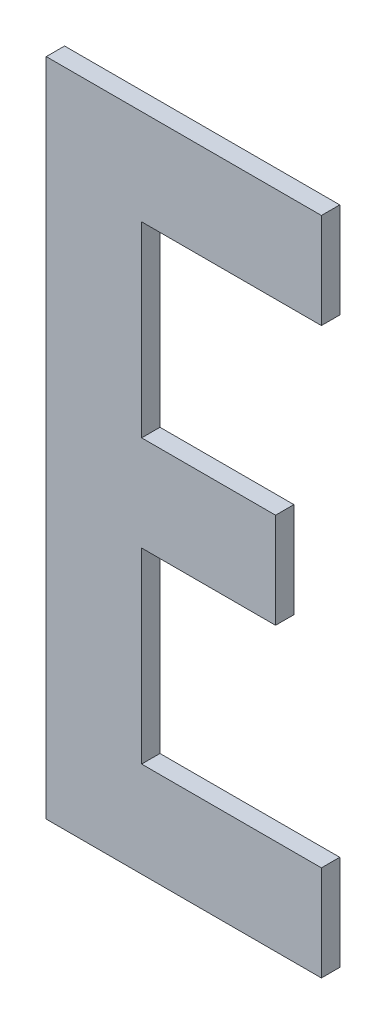
ISO-10303-21;
HEADER;
FILE_DESCRIPTION(('STEP AP214'),'2;1');
FILE_NAME('part.step','',(''),(''),'','','');
FILE_SCHEMA(('AUTOMOTIVE_DESIGN { 1 0 10303 214 1 1 1 1 }'));
ENDSEC;
DATA;
#1=APPLICATION_CONTEXT('core data for automotive mechanical design processes');
#2=APPLICATION_PROTOCOL_DEFINITION('international standard','automotive_design',2000,#1);
#3=PRODUCT_CONTEXT('',#1,'mechanical');
#4=PRODUCT('Part','Part','',(#3));
#5=PRODUCT_RELATED_PRODUCT_CATEGORY('part','',(#4));
#6=PRODUCT_DEFINITION_FORMATION('','',#4);
#7=PRODUCT_DEFINITION_CONTEXT('part definition',#1,'design');
#8=PRODUCT_DEFINITION('design','',#6,#7);
#9=PRODUCT_DEFINITION_SHAPE('','',#8);
#10=(LENGTH_UNIT() NAMED_UNIT(*) SI_UNIT(.MILLI.,.METRE.));
#11=(NAMED_UNIT(*) PLANE_ANGLE_UNIT() SI_UNIT($,.RADIAN.));
#12=(NAMED_UNIT(*) SI_UNIT($,.STERADIAN.) SOLID_ANGLE_UNIT());
#13=UNCERTAINTY_MEASURE_WITH_UNIT(LENGTH_MEASURE(1.E-05),#10,'distance_accuracy_value','');
#14=(GEOMETRIC_REPRESENTATION_CONTEXT(3) GLOBAL_UNCERTAINTY_ASSIGNED_CONTEXT((#13)) GLOBAL_UNIT_ASSIGNED_CONTEXT((#10,
#11,#12)) REPRESENTATION_CONTEXT('',''));
#15=CARTESIAN_POINT('',(0.,0.,0.));
#16=DIRECTION('',(0.,0.,1.));
#17=DIRECTION('',(1.,0.,0.));
#18=AXIS2_PLACEMENT_3D('',#15,#16,#17);
#19=CARTESIAN_POINT('',(0.,374.566226912929,25.4));
#20=DIRECTION('',(0.,-1.,0.));
#21=DIRECTION('',(0.,0.,-1.));
#22=AXIS2_PLACEMENT_3D('',#19,#20,#21);
#23=PLANE('',#22);
#24=DIRECTION('',(-1.,0.,0.));
#25=VECTOR('',#24,1.);
#26=CARTESIAN_POINT('',(0.,374.566226912929,0.));
#27=LINE('',#26,#25);
#28=CARTESIAN_POINT('',(381.,374.566226912929,0.));
#29=VERTEX_POINT('',#28);
#30=CARTESIAN_POINT('',(0.,374.566226912929,0.));
#31=VERTEX_POINT('',#30);
#32=EDGE_CURVE('E153',#29,#31,#27,.T.);
#33=ORIENTED_EDGE('',*,*,#32,.T.);
#34=DIRECTION('',(0.,0.,-1.));
#35=VECTOR('',#34,1.);
#36=CARTESIAN_POINT('',(0.,374.566226912929,25.4));
#37=LINE('',#36,#35);
#38=CARTESIAN_POINT('',(0.,374.566226912929,25.4));
#39=VERTEX_POINT('',#38);
#40=EDGE_CURVE('E11',#39,#31,#37,.T.);
#41=ORIENTED_EDGE('',*,*,#40,.F.);
#42=DIRECTION('',(-1.,0.,0.));
#43=VECTOR('',#42,1.);
#44=CARTESIAN_POINT('',(0.,374.566226912929,25.4));
#45=LINE('',#44,#43);
#46=CARTESIAN_POINT('',(381.,374.566226912929,25.4));
#47=VERTEX_POINT('',#46);
#48=EDGE_CURVE('E175',#47,#39,#45,.T.);
#49=ORIENTED_EDGE('',*,*,#48,.F.);
#50=DIRECTION('',(0.,0.,-1.));
#51=VECTOR('',#50,1.);
#52=CARTESIAN_POINT('',(381.,374.566226912929,25.4));
#53=LINE('',#52,#51);
#54=EDGE_CURVE('E149',#47,#29,#53,.T.);
#55=ORIENTED_EDGE('',*,*,#54,.T.);
#56=EDGE_LOOP('',(#33,#41,#49,#55));
#57=FACE_BOUND('',#56,.T.);
#58=ADVANCED_FACE('F33',(#57),#23,.F.);
#59=CARTESIAN_POINT('',(0.,374.566226912929,25.4));
#60=DIRECTION('',(1.,0.,0.));
#61=DIRECTION('',(0.,0.,-1.));
#62=AXIS2_PLACEMENT_3D('',#59,#60,#61);
#63=PLANE('',#62);
#64=DIRECTION('',(0.,-1.,0.));
#65=VECTOR('',#64,1.);
#66=CARTESIAN_POINT('',(0.,374.566226912929,0.));
#67=LINE('',#66,#65);
#68=CARTESIAN_POINT('',(0.,-539.833773087071,0.));
#69=VERTEX_POINT('',#68);
#70=EDGE_CURVE('E156',#31,#69,#67,.T.);
#71=ORIENTED_EDGE('',*,*,#70,.T.);
#72=DIRECTION('',(0.,0.,-1.));
#73=VECTOR('',#72,1.);
#74=CARTESIAN_POINT('',(0.,-539.833773087071,25.4));
#75=LINE('',#74,#73);
#76=CARTESIAN_POINT('',(0.,-539.833773087071,25.4));
#77=VERTEX_POINT('',#76);
#78=EDGE_CURVE('E41',#77,#69,#75,.T.);
#79=ORIENTED_EDGE('',*,*,#78,.F.);
#80=DIRECTION('',(0.,-1.,0.));
#81=VECTOR('',#80,1.);
#82=CARTESIAN_POINT('',(0.,374.566226912929,25.4));
#83=LINE('',#82,#81);
#84=EDGE_CURVE('E104',#39,#77,#83,.T.);
#85=ORIENTED_EDGE('',*,*,#84,.F.);
#86=ORIENTED_EDGE('',*,*,#40,.T.);
#87=EDGE_LOOP('',(#71,#79,#85,#86));
#88=FACE_BOUND('',#87,.T.);
#89=ADVANCED_FACE('F253',(#88),#63,.F.);
#90=CARTESIAN_POINT('',(381.,-539.833773087071,25.4));
#91=DIRECTION('',(0.,1.,0.));
#92=DIRECTION('',(0.,0.,1.));
#93=AXIS2_PLACEMENT_3D('',#90,#91,#92);
#94=PLANE('',#93);
#95=DIRECTION('',(1.,0.,0.));
#96=VECTOR('',#95,1.);
#97=CARTESIAN_POINT('',(381.,-539.833773087071,0.));
#98=LINE('',#97,#96);
#99=CARTESIAN_POINT('',(381.,-539.833773087071,0.));
#100=VERTEX_POINT('',#99);
#101=EDGE_CURVE('E158',#69,#100,#98,.T.);
#102=ORIENTED_EDGE('',*,*,#101,.T.);
#103=DIRECTION('',(0.,0.,-1.));
#104=VECTOR('',#103,1.);
#105=CARTESIAN_POINT('',(381.,-539.833773087071,25.4));
#106=LINE('',#105,#104);
#107=CARTESIAN_POINT('',(381.,-539.833773087071,25.4));
#108=VERTEX_POINT('',#107);
#109=EDGE_CURVE('E194',#108,#100,#106,.T.);
#110=ORIENTED_EDGE('',*,*,#109,.F.);
#111=DIRECTION('',(1.,0.,0.));
#112=VECTOR('',#111,1.);
#113=CARTESIAN_POINT('',(381.,-539.833773087071,25.4));
#114=LINE('',#113,#112);
#115=EDGE_CURVE('E202',#77,#108,#114,.T.);
#116=ORIENTED_EDGE('',*,*,#115,.F.);
#117=ORIENTED_EDGE('',*,*,#78,.T.);
#118=EDGE_LOOP('',(#102,#110,#116,#117));
#119=FACE_BOUND('',#118,.T.);
#120=ADVANCED_FACE('F200',(#119),#94,.F.);
#121=CARTESIAN_POINT('',(381.,-407.753773087071,25.4));
#122=DIRECTION('',(-1.,0.,0.));
#123=DIRECTION('',(0.,0.,1.));
#124=AXIS2_PLACEMENT_3D('',#121,#122,#123);
#125=PLANE('',#124);
#126=DIRECTION('',(0.,1.,0.));
#127=VECTOR('',#126,1.);
#128=CARTESIAN_POINT('',(381.,-407.753773087071,0.));
#129=LINE('',#128,#127);
#130=CARTESIAN_POINT('',(381.,-407.753773087071,0.));
#131=VERTEX_POINT('',#130);
#132=EDGE_CURVE('E160',#100,#131,#129,.T.);
#133=ORIENTED_EDGE('',*,*,#132,.T.);
#134=DIRECTION('',(0.,0.,-1.));
#135=VECTOR('',#134,1.);
#136=CARTESIAN_POINT('',(381.,-407.753773087071,25.4));
#137=LINE('',#136,#135);
#138=CARTESIAN_POINT('',(381.,-407.753773087071,25.4));
#139=VERTEX_POINT('',#138);
#140=EDGE_CURVE('E191',#139,#131,#137,.T.);
#141=ORIENTED_EDGE('',*,*,#140,.F.);
#142=DIRECTION('',(0.,1.,0.));
#143=VECTOR('',#142,1.);
#144=CARTESIAN_POINT('',(381.,-407.753773087071,25.4));
#145=LINE('',#144,#143);
#146=EDGE_CURVE('E220',#108,#139,#145,.T.);
#147=ORIENTED_EDGE('',*,*,#146,.F.);
#148=ORIENTED_EDGE('',*,*,#109,.T.);
#149=EDGE_LOOP('',(#133,#141,#147,#148));
#150=FACE_BOUND('',#149,.T.);
#151=ADVANCED_FACE('F211',(#150),#125,.F.);
#152=CARTESIAN_POINT('',(132.08,-407.753773087071,25.4));
#153=DIRECTION('',(0.,-1.,0.));
#154=DIRECTION('',(0.,0.,-1.));
#155=AXIS2_PLACEMENT_3D('',#152,#153,#154);
#156=PLANE('',#155);
#157=DIRECTION('',(-1.,0.,0.));
#158=VECTOR('',#157,1.);
#159=CARTESIAN_POINT('',(132.08,-407.753773087071,0.));
#160=LINE('',#159,#158);
#161=CARTESIAN_POINT('',(132.08,-407.753773087071,0.));
#162=VERTEX_POINT('',#161);
#163=EDGE_CURVE('E162',#131,#162,#160,.T.);
#164=ORIENTED_EDGE('',*,*,#163,.T.);
#165=DIRECTION('',(0.,0.,-1.));
#166=VECTOR('',#165,1.);
#167=CARTESIAN_POINT('',(132.08,-407.753773087071,25.4));
#168=LINE('',#167,#166);
#169=CARTESIAN_POINT('',(132.08,-407.753773087071,25.4));
#170=VERTEX_POINT('',#169);
#171=EDGE_CURVE('E188',#170,#162,#168,.T.);
#172=ORIENTED_EDGE('',*,*,#171,.F.);
#173=DIRECTION('',(-1.,0.,0.));
#174=VECTOR('',#173,1.);
#175=CARTESIAN_POINT('',(132.08,-407.753773087071,25.4));
#176=LINE('',#175,#174);
#177=EDGE_CURVE('E217',#139,#170,#176,.T.);
#178=ORIENTED_EDGE('',*,*,#177,.F.);
#179=ORIENTED_EDGE('',*,*,#140,.T.);
#180=EDGE_LOOP('',(#164,#172,#178,#179));
#181=FACE_BOUND('',#180,.T.);
#182=ADVANCED_FACE('F215',(#181),#156,.F.);
#183=CARTESIAN_POINT('',(132.08,-148.673773087071,25.4));
#184=DIRECTION('',(-1.,0.,0.));
#185=DIRECTION('',(0.,-1.,0.));
#186=AXIS2_PLACEMENT_3D('',#183,#184,#185);
#187=PLANE('',#186);
#188=DIRECTION('',(0.,1.,0.));
#189=VECTOR('',#188,1.);
#190=CARTESIAN_POINT('',(132.08,-148.673773087071,0.));
#191=LINE('',#190,#189);
#192=CARTESIAN_POINT('',(132.08,-148.673773087071,0.));
#193=VERTEX_POINT('',#192);
#194=EDGE_CURVE('E164',#162,#193,#191,.T.);
#195=ORIENTED_EDGE('',*,*,#194,.T.);
#196=DIRECTION('',(0.,0.,-1.));
#197=VECTOR('',#196,1.);
#198=CARTESIAN_POINT('',(132.08,-148.673773087071,25.4));
#199=LINE('',#198,#197);
#200=CARTESIAN_POINT('',(132.08,-148.673773087071,25.4));
#201=VERTEX_POINT('',#200);
#202=EDGE_CURVE('E185',#201,#193,#199,.T.);
#203=ORIENTED_EDGE('',*,*,#202,.F.);
#204=DIRECTION('',(0.,1.,0.));
#205=VECTOR('',#204,1.);
#206=CARTESIAN_POINT('',(132.08,-148.673773087071,25.4));
#207=LINE('',#206,#205);
#208=EDGE_CURVE('E219',#170,#201,#207,.T.);
#209=ORIENTED_EDGE('',*,*,#208,.F.);
#210=ORIENTED_EDGE('',*,*,#171,.T.);
#211=EDGE_LOOP('',(#195,#203,#209,#210));
#212=FACE_BOUND('',#211,.T.);
#213=ADVANCED_FACE('F266',(#212),#187,.F.);
#214=CARTESIAN_POINT('',(317.5,-148.673773087071,25.4));
#215=DIRECTION('',(0.,1.,0.));
#216=DIRECTION('',(-1.,0.,0.));
#217=AXIS2_PLACEMENT_3D('',#214,#215,#216);
#218=PLANE('',#217);
#219=DIRECTION('',(1.,0.,0.));
#220=VECTOR('',#219,1.);
#221=CARTESIAN_POINT('',(317.5,-148.673773087071,0.));
#222=LINE('',#221,#220);
#223=CARTESIAN_POINT('',(317.5,-148.673773087071,0.));
#224=VERTEX_POINT('',#223);
#225=EDGE_CURVE('E166',#193,#224,#222,.T.);
#226=ORIENTED_EDGE('',*,*,#225,.T.);
#227=DIRECTION('',(0.,0.,-1.));
#228=VECTOR('',#227,1.);
#229=CARTESIAN_POINT('',(317.5,-148.673773087071,25.4));
#230=LINE('',#229,#228);
#231=CARTESIAN_POINT('',(317.5,-148.673773087071,25.4));
#232=VERTEX_POINT('',#231);
#233=EDGE_CURVE('E182',#232,#224,#230,.T.);
#234=ORIENTED_EDGE('',*,*,#233,.F.);
#235=DIRECTION('',(1.,0.,0.));
#236=VECTOR('',#235,1.);
#237=CARTESIAN_POINT('',(317.5,-148.673773087071,25.4));
#238=LINE('',#237,#236);
#239=EDGE_CURVE('E222',#201,#232,#238,.T.);
#240=ORIENTED_EDGE('',*,*,#239,.F.);
#241=ORIENTED_EDGE('',*,*,#202,.T.);
#242=EDGE_LOOP('',(#226,#234,#240,#241));
#243=FACE_BOUND('',#242,.T.);
#244=ADVANCED_FACE('F269',(#243),#218,.F.);
#245=CARTESIAN_POINT('',(317.5,-16.5937730870713,25.4));
#246=DIRECTION('',(-1.,0.,0.));
#247=DIRECTION('',(0.,0.,1.));
#248=AXIS2_PLACEMENT_3D('',#245,#246,#247);
#249=PLANE('',#248);
#250=DIRECTION('',(0.,1.,0.));
#251=VECTOR('',#250,1.);
#252=CARTESIAN_POINT('',(317.5,-16.5937730870713,0.));
#253=LINE('',#252,#251);
#254=CARTESIAN_POINT('',(317.5,-16.5937730870713,0.));
#255=VERTEX_POINT('',#254);
#256=EDGE_CURVE('E168',#224,#255,#253,.T.);
#257=ORIENTED_EDGE('',*,*,#256,.T.);
#258=DIRECTION('',(0.,0.,-1.));
#259=VECTOR('',#258,1.);
#260=CARTESIAN_POINT('',(317.5,-16.5937730870713,25.4));
#261=LINE('',#260,#259);
#262=CARTESIAN_POINT('',(317.5,-16.5937730870713,25.4));
#263=VERTEX_POINT('',#262);
#264=EDGE_CURVE('E179',#263,#255,#261,.T.);
#265=ORIENTED_EDGE('',*,*,#264,.F.);
#266=DIRECTION('',(0.,1.,0.));
#267=VECTOR('',#266,1.);
#268=CARTESIAN_POINT('',(317.5,-16.5937730870713,25.4));
#269=LINE('',#268,#267);
#270=EDGE_CURVE('E228',#232,#263,#269,.T.);
#271=ORIENTED_EDGE('',*,*,#270,.F.);
#272=ORIENTED_EDGE('',*,*,#233,.T.);
#273=EDGE_LOOP('',(#257,#265,#271,#272));
#274=FACE_BOUND('',#273,.T.);
#275=ADVANCED_FACE('F234',(#274),#249,.F.);
#276=CARTESIAN_POINT('',(132.08,-16.5937730870713,25.4));
#277=DIRECTION('',(0.,-1.,0.));
#278=DIRECTION('',(0.,0.,-1.));
#279=AXIS2_PLACEMENT_3D('',#276,#277,#278);
#280=PLANE('',#279);
#281=DIRECTION('',(-1.,0.,0.));
#282=VECTOR('',#281,1.);
#283=CARTESIAN_POINT('',(132.08,-16.5937730870713,0.));
#284=LINE('',#283,#282);
#285=CARTESIAN_POINT('',(132.08,-16.5937730870713,0.));
#286=VERTEX_POINT('',#285);
#287=EDGE_CURVE('E170',#255,#286,#284,.T.);
#288=ORIENTED_EDGE('',*,*,#287,.T.);
#289=DIRECTION('',(0.,0.,-1.));
#290=VECTOR('',#289,1.);
#291=CARTESIAN_POINT('',(132.08,-16.5937730870713,25.4));
#292=LINE('',#291,#290);
#293=CARTESIAN_POINT('',(132.08,-16.5937730870713,25.4));
#294=VERTEX_POINT('',#293);
#295=EDGE_CURVE('E144',#294,#286,#292,.T.);
#296=ORIENTED_EDGE('',*,*,#295,.F.);
#297=DIRECTION('',(-1.,0.,0.));
#298=VECTOR('',#297,1.);
#299=CARTESIAN_POINT('',(132.08,-16.5937730870713,25.4));
#300=LINE('',#299,#298);
#301=EDGE_CURVE('E135',#263,#294,#300,.T.);
#302=ORIENTED_EDGE('',*,*,#301,.F.);
#303=ORIENTED_EDGE('',*,*,#264,.T.);
#304=EDGE_LOOP('',(#288,#296,#302,#303));
#305=FACE_BOUND('',#304,.T.);
#306=ADVANCED_FACE('F238',(#305),#280,.F.);
#307=CARTESIAN_POINT('',(132.08,242.486226912929,25.4));
#308=DIRECTION('',(-1.,0.,0.));
#309=DIRECTION('',(0.,-1.,0.));
#310=AXIS2_PLACEMENT_3D('',#307,#308,#309);
#311=PLANE('',#310);
#312=DIRECTION('',(0.,1.,0.));
#313=VECTOR('',#312,1.);
#314=CARTESIAN_POINT('',(132.08,242.486226912929,0.));
#315=LINE('',#314,#313);
#316=CARTESIAN_POINT('',(132.08,242.486226912929,0.));
#317=VERTEX_POINT('',#316);
#318=EDGE_CURVE('E143',#286,#317,#315,.T.);
#319=ORIENTED_EDGE('',*,*,#318,.T.);
#320=DIRECTION('',(0.,0.,-1.));
#321=VECTOR('',#320,1.);
#322=CARTESIAN_POINT('',(132.08,242.486226912929,25.4));
#323=LINE('',#322,#321);
#324=CARTESIAN_POINT('',(132.08,242.486226912929,25.4));
#325=VERTEX_POINT('',#324);
#326=EDGE_CURVE('E140',#325,#317,#323,.T.);
#327=ORIENTED_EDGE('',*,*,#326,.F.);
#328=DIRECTION('',(0.,1.,0.));
#329=VECTOR('',#328,1.);
#330=CARTESIAN_POINT('',(132.08,242.486226912929,25.4));
#331=LINE('',#330,#329);
#332=EDGE_CURVE('E129',#294,#325,#331,.T.);
#333=ORIENTED_EDGE('',*,*,#332,.F.);
#334=ORIENTED_EDGE('',*,*,#295,.T.);
#335=EDGE_LOOP('',(#319,#327,#333,#334));
#336=FACE_BOUND('',#335,.T.);
#337=ADVANCED_FACE('F141',(#336),#311,.F.);
#338=CARTESIAN_POINT('',(381.,242.486226912929,25.4));
#339=DIRECTION('',(0.,1.,0.));
#340=DIRECTION('',(-1.,0.,0.));
#341=AXIS2_PLACEMENT_3D('',#338,#339,#340);
#342=PLANE('',#341);
#343=DIRECTION('',(1.,0.,0.));
#344=VECTOR('',#343,1.);
#345=CARTESIAN_POINT('',(381.,242.486226912929,0.));
#346=LINE('',#345,#344);
#347=CARTESIAN_POINT('',(381.,242.486226912929,0.));
#348=VERTEX_POINT('',#347);
#349=EDGE_CURVE('E90',#317,#348,#346,.T.);
#350=ORIENTED_EDGE('',*,*,#349,.T.);
#351=DIRECTION('',(0.,0.,-1.));
#352=VECTOR('',#351,1.);
#353=CARTESIAN_POINT('',(381.,242.486226912929,25.4));
#354=LINE('',#353,#352);
#355=CARTESIAN_POINT('',(381.,242.486226912929,25.4));
#356=VERTEX_POINT('',#355);
#357=EDGE_CURVE('E145',#356,#348,#354,.T.);
#358=ORIENTED_EDGE('',*,*,#357,.F.);
#359=DIRECTION('',(1.,0.,0.));
#360=VECTOR('',#359,1.);
#361=CARTESIAN_POINT('',(381.,242.486226912929,25.4));
#362=LINE('',#361,#360);
#363=EDGE_CURVE('E133',#325,#356,#362,.T.);
#364=ORIENTED_EDGE('',*,*,#363,.F.);
#365=ORIENTED_EDGE('',*,*,#326,.T.);
#366=EDGE_LOOP('',(#350,#358,#364,#365));
#367=FACE_BOUND('',#366,.T.);
#368=ADVANCED_FACE('F147',(#367),#342,.F.);
#369=CARTESIAN_POINT('',(381.,374.566226912929,25.4));
#370=DIRECTION('',(-1.,0.,0.));
#371=DIRECTION('',(0.,0.,1.));
#372=AXIS2_PLACEMENT_3D('',#369,#370,#371);
#373=PLANE('',#372);
#374=DIRECTION('',(0.,1.,0.));
#375=VECTOR('',#374,1.);
#376=CARTESIAN_POINT('',(381.,374.566226912929,0.));
#377=LINE('',#376,#375);
#378=EDGE_CURVE('E96',#348,#29,#377,.T.);
#379=ORIENTED_EDGE('',*,*,#378,.T.);
#380=ORIENTED_EDGE('',*,*,#54,.F.);
#381=DIRECTION('',(0.,1.,0.));
#382=VECTOR('',#381,1.);
#383=CARTESIAN_POINT('',(381.,374.566226912929,25.4));
#384=LINE('',#383,#382);
#385=EDGE_CURVE('E49',#356,#47,#384,.T.);
#386=ORIENTED_EDGE('',*,*,#385,.F.);
#387=ORIENTED_EDGE('',*,*,#357,.T.);
#388=EDGE_LOOP('',(#379,#380,#386,#387));
#389=FACE_BOUND('',#388,.T.);
#390=ADVANCED_FACE('F242',(#389),#373,.F.);
#391=CARTESIAN_POINT('',(0.,0.,25.4));
#392=DIRECTION('',(0.,0.,-1.));
#393=DIRECTION('',(-1.,0.,0.));
#394=AXIS2_PLACEMENT_3D('',#391,#392,#393);
#395=PLANE('',#394);
#396=ORIENTED_EDGE('',*,*,#48,.T.);
#397=ORIENTED_EDGE('',*,*,#84,.T.);
#398=ORIENTED_EDGE('',*,*,#115,.T.);
#399=ORIENTED_EDGE('',*,*,#146,.T.);
#400=ORIENTED_EDGE('',*,*,#177,.T.);
#401=ORIENTED_EDGE('',*,*,#208,.T.);
#402=ORIENTED_EDGE('',*,*,#239,.T.);
#403=ORIENTED_EDGE('',*,*,#270,.T.);
#404=ORIENTED_EDGE('',*,*,#301,.T.);
#405=ORIENTED_EDGE('',*,*,#332,.T.);
#406=ORIENTED_EDGE('',*,*,#363,.T.);
#407=ORIENTED_EDGE('',*,*,#385,.T.);
#408=EDGE_LOOP('',(#396,#397,#398,#399,#400,#401,#402,#403,#404,#405,#406,#407));
#409=FACE_BOUND('',#408,.T.);
#410=ADVANCED_FACE('F131',(#409),#395,.F.);
#411=CARTESIAN_POINT('',(0.,0.,0.));
#412=DIRECTION('',(0.,0.,-1.));
#413=DIRECTION('',(-1.,0.,0.));
#414=AXIS2_PLACEMENT_3D('',#411,#412,#413);
#415=PLANE('',#414);
#416=ORIENTED_EDGE('',*,*,#32,.F.);
#417=ORIENTED_EDGE('',*,*,#378,.F.);
#418=ORIENTED_EDGE('',*,*,#349,.F.);
#419=ORIENTED_EDGE('',*,*,#318,.F.);
#420=ORIENTED_EDGE('',*,*,#287,.F.);
#421=ORIENTED_EDGE('',*,*,#256,.F.);
#422=ORIENTED_EDGE('',*,*,#225,.F.);
#423=ORIENTED_EDGE('',*,*,#194,.F.);
#424=ORIENTED_EDGE('',*,*,#163,.F.);
#425=ORIENTED_EDGE('',*,*,#132,.F.);
#426=ORIENTED_EDGE('',*,*,#101,.F.);
#427=ORIENTED_EDGE('',*,*,#70,.F.);
#428=EDGE_LOOP('',(#416,#417,#418,#419,#420,#421,#422,#423,#424,#425,#426,#427));
#429=FACE_BOUND('',#428,.T.);
#430=ADVANCED_FACE('F206',(#429),#415,.T.);
#431=CLOSED_SHELL('',(#58,#89,#120,#151,#182,#213,#244,#275,#306,#337,#368,#390,#410,#430));
#432=MANIFOLD_SOLID_BREP('B2',#431);
#433=ADVANCED_BREP_SHAPE_REPRESENTATION('',(#18,#432),#14);
#434=SHAPE_DEFINITION_REPRESENTATION(#9,#433);
ENDSEC;
END-ISO-10303-21;
